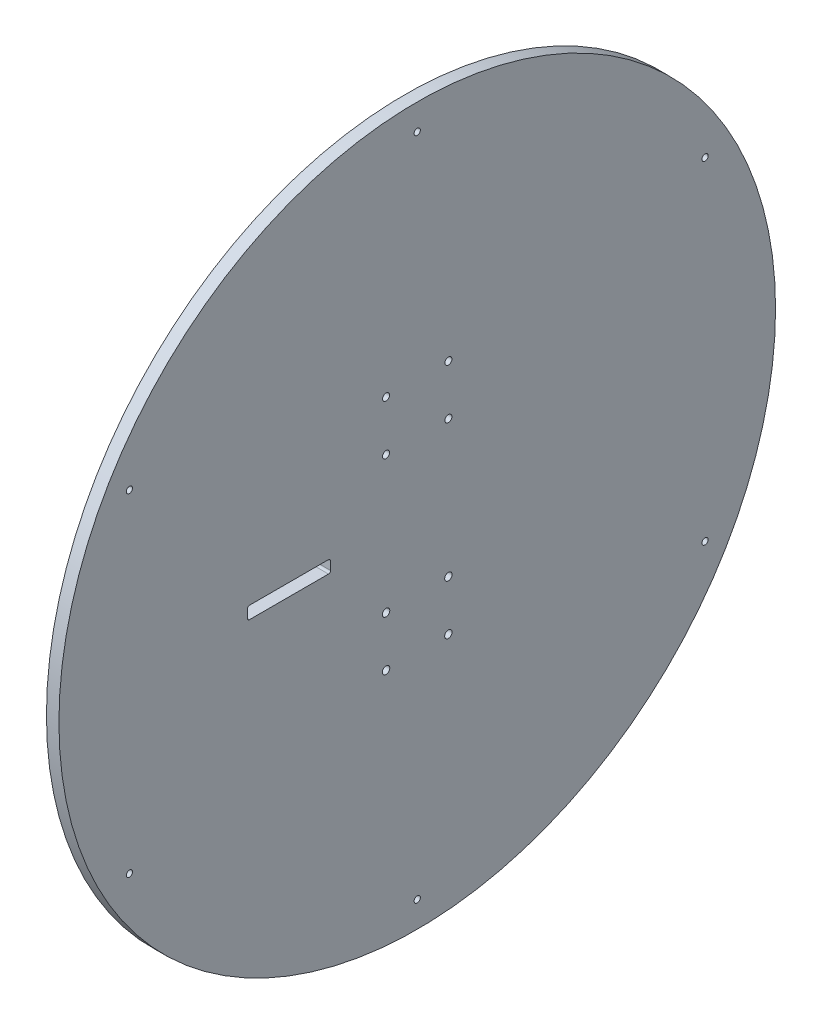
ISO-10303-21;
HEADER;
FILE_DESCRIPTION(('STEP AP214'),'2;1');
FILE_NAME('part.step','',(''),(''),'','','');
FILE_SCHEMA(('AUTOMOTIVE_DESIGN { 1 0 10303 214 1 1 1 1 }'));
ENDSEC;
DATA;
#1=APPLICATION_CONTEXT('core data for automotive mechanical design processes');
#2=APPLICATION_PROTOCOL_DEFINITION('international standard','automotive_design',2000,#1);
#3=PRODUCT_CONTEXT('',#1,'mechanical');
#4=PRODUCT('Part','Part','',(#3));
#5=PRODUCT_RELATED_PRODUCT_CATEGORY('part','',(#4));
#6=PRODUCT_DEFINITION_FORMATION('','',#4);
#7=PRODUCT_DEFINITION_CONTEXT('part definition',#1,'design');
#8=PRODUCT_DEFINITION('design','',#6,#7);
#9=PRODUCT_DEFINITION_SHAPE('','',#8);
#10=(LENGTH_UNIT() NAMED_UNIT(*) SI_UNIT(.MILLI.,.METRE.));
#11=(NAMED_UNIT(*) PLANE_ANGLE_UNIT() SI_UNIT($,.RADIAN.));
#12=(NAMED_UNIT(*) SI_UNIT($,.STERADIAN.) SOLID_ANGLE_UNIT());
#13=UNCERTAINTY_MEASURE_WITH_UNIT(LENGTH_MEASURE(1.E-05),#10,'distance_accuracy_value','');
#14=(GEOMETRIC_REPRESENTATION_CONTEXT(3) GLOBAL_UNCERTAINTY_ASSIGNED_CONTEXT((#13)) GLOBAL_UNIT_ASSIGNED_CONTEXT((#10,
#11,#12)) REPRESENTATION_CONTEXT('',''));
#15=CARTESIAN_POINT('',(0.,0.,0.));
#16=DIRECTION('',(0.,0.,1.));
#17=DIRECTION('',(1.,0.,0.));
#18=AXIS2_PLACEMENT_3D('',#15,#16,#17);
#19=CARTESIAN_POINT('',(-6.,2.00000000000001,42.7305916988347));
#20=DIRECTION('',(1.,0.,0.));
#21=DIRECTION('',(0.,0.,-1.));
#22=AXIS2_PLACEMENT_3D('',#19,#20,#21);
#23=CYLINDRICAL_SURFACE('',#22,1.);
#24=CARTESIAN_POINT('',(0.,2.00000000000001,42.7305916988347));
#25=DIRECTION('',(1.,0.,0.));
#26=DIRECTION('',(0.,0.,-1.));
#27=AXIS2_PLACEMENT_3D('',#24,#25,#26);
#28=CIRCLE('',#27,1.);
#29=CARTESIAN_POINT('',(0.,3.00000000000001,42.7305916988347));
#30=VERTEX_POINT('',#29);
#31=CARTESIAN_POINT('',(0.,2.,41.7305916988347));
#32=VERTEX_POINT('',#31);
#33=EDGE_CURVE('E180',#30,#32,#28,.F.);
#34=ORIENTED_EDGE('',*,*,#33,.F.);
#35=DIRECTION('',(1.,0.,0.));
#36=VECTOR('',#35,1.);
#37=CARTESIAN_POINT('',(-6.,3.00000000000001,42.7305916988347));
#38=LINE('',#37,#36);
#39=CARTESIAN_POINT('',(-6.,3.00000000000001,42.7305916988347));
#40=VERTEX_POINT('',#39);
#41=EDGE_CURVE('E11',#40,#30,#38,.T.);
#42=ORIENTED_EDGE('',*,*,#41,.F.);
#43=CARTESIAN_POINT('',(-6.,2.00000000000001,42.7305916988347));
#44=DIRECTION('',(1.,0.,0.));
#45=DIRECTION('',(0.,0.,-1.));
#46=AXIS2_PLACEMENT_3D('',#43,#44,#45);
#47=CIRCLE('',#46,1.);
#48=CARTESIAN_POINT('',(-6.,2.,41.7305916988347));
#49=VERTEX_POINT('',#48);
#50=EDGE_CURVE('E244',#40,#49,#47,.F.);
#51=ORIENTED_EDGE('',*,*,#50,.T.);
#52=DIRECTION('',(1.,0.,0.));
#53=VECTOR('',#52,1.);
#54=CARTESIAN_POINT('',(-6.,2.,41.7305916988347));
#55=LINE('',#54,#53);
#56=EDGE_CURVE('E42',#49,#32,#55,.T.);
#57=ORIENTED_EDGE('',*,*,#56,.T.);
#58=EDGE_LOOP('',(#34,#42,#51,#57));
#59=FACE_BOUND('',#58,.T.);
#60=ADVANCED_FACE('F39',(#59),#23,.F.);
#61=CARTESIAN_POINT('',(-6.,3.00000000000002,0.));
#62=DIRECTION('',(0.,1.,0.));
#63=DIRECTION('',(0.,0.,1.));
#64=AXIS2_PLACEMENT_3D('',#61,#62,#63);
#65=PLANE('',#64);
#66=DIRECTION('',(0.,0.,1.));
#67=VECTOR('',#66,1.);
#68=CARTESIAN_POINT('',(0.,3.00000000000002,0.));
#69=LINE('',#68,#67);
#70=CARTESIAN_POINT('',(0.,2.99999999999999,80.7305916988347));
#71=VERTEX_POINT('',#70);
#72=EDGE_CURVE('E198',#30,#71,#69,.T.);
#73=ORIENTED_EDGE('',*,*,#72,.T.);
#74=DIRECTION('',(1.,0.,0.));
#75=VECTOR('',#74,1.);
#76=CARTESIAN_POINT('',(-6.,2.99999999999999,80.7305916988347));
#77=LINE('',#76,#75);
#78=CARTESIAN_POINT('',(-6.,2.99999999999999,80.7305916988347));
#79=VERTEX_POINT('',#78);
#80=EDGE_CURVE('E48',#79,#71,#77,.T.);
#81=ORIENTED_EDGE('',*,*,#80,.F.);
#82=DIRECTION('',(0.,0.,1.));
#83=VECTOR('',#82,1.);
#84=CARTESIAN_POINT('',(-6.,3.00000000000002,0.));
#85=LINE('',#84,#83);
#86=EDGE_CURVE('E130',#40,#79,#85,.T.);
#87=ORIENTED_EDGE('',*,*,#86,.F.);
#88=ORIENTED_EDGE('',*,*,#41,.T.);
#89=EDGE_LOOP('',(#73,#81,#87,#88));
#90=FACE_BOUND('',#89,.T.);
#91=ADVANCED_FACE('F257',(#90),#65,.F.);
#92=CARTESIAN_POINT('',(-6.,1.99999999999999,80.7305916988347));
#93=DIRECTION('',(1.,0.,0.));
#94=DIRECTION('',(0.,0.,-1.));
#95=AXIS2_PLACEMENT_3D('',#92,#93,#94);
#96=CYLINDRICAL_SURFACE('',#95,1.);
#97=CARTESIAN_POINT('',(0.,1.99999999999999,80.7305916988347));
#98=DIRECTION('',(1.,0.,0.));
#99=DIRECTION('',(0.,0.,-1.));
#100=AXIS2_PLACEMENT_3D('',#97,#98,#99);
#101=CIRCLE('',#100,1.);
#102=CARTESIAN_POINT('',(0.,1.99999999999999,81.7305916988347));
#103=VERTEX_POINT('',#102);
#104=EDGE_CURVE('E114',#103,#71,#101,.F.);
#105=ORIENTED_EDGE('',*,*,#104,.F.);
#106=DIRECTION('',(1.,0.,0.));
#107=VECTOR('',#106,1.);
#108=CARTESIAN_POINT('',(-6.,1.99999999999999,81.7305916988347));
#109=LINE('',#108,#107);
#110=CARTESIAN_POINT('',(-6.,1.99999999999999,81.7305916988347));
#111=VERTEX_POINT('',#110);
#112=EDGE_CURVE('E108',#111,#103,#109,.T.);
#113=ORIENTED_EDGE('',*,*,#112,.F.);
#114=CARTESIAN_POINT('',(-6.,1.99999999999999,80.7305916988347));
#115=DIRECTION('',(1.,0.,0.));
#116=DIRECTION('',(0.,0.,-1.));
#117=AXIS2_PLACEMENT_3D('',#114,#115,#116);
#118=CIRCLE('',#117,1.);
#119=EDGE_CURVE('E112',#111,#79,#118,.F.);
#120=ORIENTED_EDGE('',*,*,#119,.T.);
#121=ORIENTED_EDGE('',*,*,#80,.T.);
#122=EDGE_LOOP('',(#105,#113,#120,#121));
#123=FACE_BOUND('',#122,.T.);
#124=ADVANCED_FACE('F110',(#123),#96,.F.);
#125=CARTESIAN_POINT('',(-6.,0.,81.7305916988347));
#126=DIRECTION('',(0.,0.,1.));
#127=DIRECTION('',(1.,0.,0.));
#128=AXIS2_PLACEMENT_3D('',#125,#126,#127);
#129=PLANE('',#128);
#130=DIRECTION('',(0.,-1.,0.));
#131=VECTOR('',#130,1.);
#132=CARTESIAN_POINT('',(0.,0.,81.7305916988347));
#133=LINE('',#132,#131);
#134=CARTESIAN_POINT('',(0.,-2.,81.7305916988347));
#135=VERTEX_POINT('',#134);
#136=EDGE_CURVE('E195',#103,#135,#133,.T.);
#137=ORIENTED_EDGE('',*,*,#136,.T.);
#138=DIRECTION('',(1.,0.,0.));
#139=VECTOR('',#138,1.);
#140=CARTESIAN_POINT('',(-6.,-2.,81.7305916988347));
#141=LINE('',#140,#139);
#142=CARTESIAN_POINT('',(-6.,-2.,81.7305916988347));
#143=VERTEX_POINT('',#142);
#144=EDGE_CURVE('E117',#143,#135,#141,.T.);
#145=ORIENTED_EDGE('',*,*,#144,.F.);
#146=DIRECTION('',(0.,-1.,0.));
#147=VECTOR('',#146,1.);
#148=CARTESIAN_POINT('',(-6.,0.,81.7305916988347));
#149=LINE('',#148,#147);
#150=EDGE_CURVE('E120',#111,#143,#149,.T.);
#151=ORIENTED_EDGE('',*,*,#150,.F.);
#152=ORIENTED_EDGE('',*,*,#112,.T.);
#153=EDGE_LOOP('',(#137,#145,#151,#152));
#154=FACE_BOUND('',#153,.T.);
#155=ADVANCED_FACE('F121',(#154),#129,.F.);
#156=CARTESIAN_POINT('',(-6.,-2.00000000000001,80.7305916988347));
#157=DIRECTION('',(1.,0.,0.));
#158=DIRECTION('',(0.,0.,-1.));
#159=AXIS2_PLACEMENT_3D('',#156,#157,#158);
#160=CYLINDRICAL_SURFACE('',#159,1.);
#161=CARTESIAN_POINT('',(0.,-2.00000000000001,80.7305916988347));
#162=DIRECTION('',(1.,0.,0.));
#163=DIRECTION('',(0.,0.,-1.));
#164=AXIS2_PLACEMENT_3D('',#161,#162,#163);
#165=CIRCLE('',#164,1.);
#166=CARTESIAN_POINT('',(0.,-3.00000000000001,80.7305916988347));
#167=VERTEX_POINT('',#166);
#168=EDGE_CURVE('E192',#135,#167,#165,.T.);
#169=ORIENTED_EDGE('',*,*,#168,.T.);
#170=DIRECTION('',(1.,0.,0.));
#171=VECTOR('',#170,1.);
#172=CARTESIAN_POINT('',(-6.,-3.00000000000001,80.7305916988347));
#173=LINE('',#172,#171);
#174=CARTESIAN_POINT('',(-6.,-3.00000000000001,80.7305916988347));
#175=VERTEX_POINT('',#174);
#176=EDGE_CURVE('E248',#175,#167,#173,.T.);
#177=ORIENTED_EDGE('',*,*,#176,.F.);
#178=CARTESIAN_POINT('',(-6.,-2.00000000000001,80.7305916988347));
#179=DIRECTION('',(1.,0.,0.));
#180=DIRECTION('',(0.,0.,-1.));
#181=AXIS2_PLACEMENT_3D('',#178,#179,#180);
#182=CIRCLE('',#181,1.);
#183=EDGE_CURVE('E125',#143,#175,#182,.T.);
#184=ORIENTED_EDGE('',*,*,#183,.F.);
#185=ORIENTED_EDGE('',*,*,#144,.T.);
#186=EDGE_LOOP('',(#169,#177,#184,#185));
#187=FACE_BOUND('',#186,.T.);
#188=ADVANCED_FACE('F271',(#187),#160,.F.);
#189=CARTESIAN_POINT('',(-6.,-2.99999999999998,0.));
#190=DIRECTION('',(0.,1.,0.));
#191=DIRECTION('',(0.,0.,1.));
#192=AXIS2_PLACEMENT_3D('',#189,#190,#191);
#193=PLANE('',#192);
#194=DIRECTION('',(0.,0.,1.));
#195=VECTOR('',#194,1.);
#196=CARTESIAN_POINT('',(0.,-2.99999999999998,0.));
#197=LINE('',#196,#195);
#198=CARTESIAN_POINT('',(0.,-2.99999999999999,42.7305916988347));
#199=VERTEX_POINT('',#198);
#200=EDGE_CURVE('E189',#199,#167,#197,.T.);
#201=ORIENTED_EDGE('',*,*,#200,.F.);
#202=DIRECTION('',(1.,0.,0.));
#203=VECTOR('',#202,1.);
#204=CARTESIAN_POINT('',(-6.,-2.99999999999999,42.7305916988347));
#205=LINE('',#204,#203);
#206=CARTESIAN_POINT('',(-6.,-2.99999999999999,42.7305916988347));
#207=VERTEX_POINT('',#206);
#208=EDGE_CURVE('E250',#207,#199,#205,.T.);
#209=ORIENTED_EDGE('',*,*,#208,.F.);
#210=DIRECTION('',(0.,0.,1.));
#211=VECTOR('',#210,1.);
#212=CARTESIAN_POINT('',(-6.,-2.99999999999998,0.));
#213=LINE('',#212,#211);
#214=EDGE_CURVE('E266',#207,#175,#213,.T.);
#215=ORIENTED_EDGE('',*,*,#214,.T.);
#216=ORIENTED_EDGE('',*,*,#176,.T.);
#217=EDGE_LOOP('',(#201,#209,#215,#216));
#218=FACE_BOUND('',#217,.T.);
#219=ADVANCED_FACE('F275',(#218),#193,.T.);
#220=CARTESIAN_POINT('',(-6.,-1.99999999999999,42.7305916988347));
#221=DIRECTION('',(1.,0.,0.));
#222=DIRECTION('',(0.,0.,-1.));
#223=AXIS2_PLACEMENT_3D('',#220,#221,#222);
#224=CYLINDRICAL_SURFACE('',#223,1.);
#225=CARTESIAN_POINT('',(0.,-1.99999999999999,42.7305916988347));
#226=DIRECTION('',(1.,0.,0.));
#227=DIRECTION('',(0.,0.,-1.));
#228=AXIS2_PLACEMENT_3D('',#225,#226,#227);
#229=CIRCLE('',#228,1.);
#230=CARTESIAN_POINT('',(0.,-1.99999999999999,41.7305916988347));
#231=VERTEX_POINT('',#230);
#232=EDGE_CURVE('E186',#231,#199,#229,.F.);
#233=ORIENTED_EDGE('',*,*,#232,.F.);
#234=DIRECTION('',(1.,0.,0.));
#235=VECTOR('',#234,1.);
#236=CARTESIAN_POINT('',(-6.,-1.99999999999999,41.7305916988347));
#237=LINE('',#236,#235);
#238=CARTESIAN_POINT('',(-6.,-1.99999999999999,41.7305916988347));
#239=VERTEX_POINT('',#238);
#240=EDGE_CURVE('E251',#239,#231,#237,.T.);
#241=ORIENTED_EDGE('',*,*,#240,.F.);
#242=CARTESIAN_POINT('',(-6.,-1.99999999999999,42.7305916988347));
#243=DIRECTION('',(1.,0.,0.));
#244=DIRECTION('',(0.,0.,-1.));
#245=AXIS2_PLACEMENT_3D('',#242,#243,#244);
#246=CIRCLE('',#245,1.);
#247=EDGE_CURVE('E261',#239,#207,#246,.F.);
#248=ORIENTED_EDGE('',*,*,#247,.T.);
#249=ORIENTED_EDGE('',*,*,#208,.T.);
#250=EDGE_LOOP('',(#233,#241,#248,#249));
#251=FACE_BOUND('',#250,.T.);
#252=ADVANCED_FACE('F277',(#251),#224,.F.);
#253=CARTESIAN_POINT('',(-6.,32.9363293094924,-15.));
#254=DIRECTION('',(1.,0.,0.));
#255=DIRECTION('',(0.,0.,-1.));
#256=AXIS2_PLACEMENT_3D('',#253,#254,#255);
#257=CYLINDRICAL_SURFACE('',#256,1.68973253813912);
#258=CARTESIAN_POINT('',(-6.,32.9363293094924,-15.));
#259=DIRECTION('',(1.,0.,0.));
#260=DIRECTION('',(0.,0.,-1.));
#261=AXIS2_PLACEMENT_3D('',#258,#259,#260);
#262=CIRCLE('',#261,1.68973253813912);
#263=CARTESIAN_POINT('',(-6.,32.9363293094924,-16.6897325381391));
#264=VERTEX_POINT('',#263);
#265=EDGE_CURVE('E174',#264,#264,#262,.T.);
#266=ORIENTED_EDGE('',*,*,#265,.F.);
#267=EDGE_LOOP('',(#266));
#268=FACE_BOUND('',#267,.T.);
#269=CARTESIAN_POINT('',(0.,32.9363293094924,-15.));
#270=DIRECTION('',(1.,0.,0.));
#271=DIRECTION('',(0.,0.,-1.));
#272=AXIS2_PLACEMENT_3D('',#269,#270,#271);
#273=CIRCLE('',#272,1.68973253813912);
#274=CARTESIAN_POINT('',(0.,32.9363293094924,-16.6897325381391));
#275=VERTEX_POINT('',#274);
#276=EDGE_CURVE('E239',#275,#275,#273,.T.);
#277=ORIENTED_EDGE('',*,*,#276,.T.);
#278=EDGE_LOOP('',(#277));
#279=FACE_BOUND('',#278,.T.);
#280=ADVANCED_FACE('F279',(#268,#279),#257,.F.);
#281=CARTESIAN_POINT('',(-6.,56.9363293094924,15.));
#282=DIRECTION('',(1.,0.,0.));
#283=DIRECTION('',(0.,0.,-1.));
#284=AXIS2_PLACEMENT_3D('',#281,#282,#283);
#285=CYLINDRICAL_SURFACE('',#284,1.68973253813912);
#286=CARTESIAN_POINT('',(-6.,56.9363293094924,15.));
#287=DIRECTION('',(1.,0.,0.));
#288=DIRECTION('',(0.,0.,-1.));
#289=AXIS2_PLACEMENT_3D('',#286,#287,#288);
#290=CIRCLE('',#289,1.68973253813912);
#291=CARTESIAN_POINT('',(-6.,56.9363293094924,13.3102674618609));
#292=VERTEX_POINT('',#291);
#293=EDGE_CURVE('E171',#292,#292,#290,.T.);
#294=ORIENTED_EDGE('',*,*,#293,.F.);
#295=EDGE_LOOP('',(#294));
#296=FACE_BOUND('',#295,.T.);
#297=CARTESIAN_POINT('',(0.,56.9363293094924,15.));
#298=DIRECTION('',(1.,0.,0.));
#299=DIRECTION('',(0.,0.,-1.));
#300=AXIS2_PLACEMENT_3D('',#297,#298,#299);
#301=CIRCLE('',#300,1.68973253813912);
#302=CARTESIAN_POINT('',(0.,56.9363293094924,13.3102674618609));
#303=VERTEX_POINT('',#302);
#304=EDGE_CURVE('E236',#303,#303,#301,.T.);
#305=ORIENTED_EDGE('',*,*,#304,.T.);
#306=EDGE_LOOP('',(#305));
#307=FACE_BOUND('',#306,.T.);
#308=ADVANCED_FACE('F285',(#296,#307),#285,.F.);
#309=CARTESIAN_POINT('',(-6.,32.9363293094924,15.));
#310=DIRECTION('',(1.,0.,0.));
#311=DIRECTION('',(0.,0.,-1.));
#312=AXIS2_PLACEMENT_3D('',#309,#310,#311);
#313=CYLINDRICAL_SURFACE('',#312,1.68973253813912);
#314=CARTESIAN_POINT('',(-6.,32.9363293094924,15.));
#315=DIRECTION('',(1.,0.,0.));
#316=DIRECTION('',(0.,0.,-1.));
#317=AXIS2_PLACEMENT_3D('',#314,#315,#316);
#318=CIRCLE('',#317,1.68973253813912);
#319=CARTESIAN_POINT('',(-6.,32.9363293094924,13.3102674618609));
#320=VERTEX_POINT('',#319);
#321=EDGE_CURVE('E168',#320,#320,#318,.T.);
#322=ORIENTED_EDGE('',*,*,#321,.F.);
#323=EDGE_LOOP('',(#322));
#324=FACE_BOUND('',#323,.T.);
#325=CARTESIAN_POINT('',(0.,32.9363293094924,15.));
#326=DIRECTION('',(1.,0.,0.));
#327=DIRECTION('',(0.,0.,-1.));
#328=AXIS2_PLACEMENT_3D('',#325,#326,#327);
#329=CIRCLE('',#328,1.68973253813912);
#330=CARTESIAN_POINT('',(0.,32.9363293094924,13.3102674618609));
#331=VERTEX_POINT('',#330);
#332=EDGE_CURVE('E233',#331,#331,#329,.T.);
#333=ORIENTED_EDGE('',*,*,#332,.T.);
#334=EDGE_LOOP('',(#333));
#335=FACE_BOUND('',#334,.T.);
#336=ADVANCED_FACE('F332',(#324,#335),#313,.F.);
#337=CARTESIAN_POINT('',(-6.,159.999999999986,1.05869761299687E-13));
#338=DIRECTION('',(1.,0.,0.));
#339=DIRECTION('',(0.,0.,-1.));
#340=AXIS2_PLACEMENT_3D('',#337,#338,#339);
#341=CYLINDRICAL_SURFACE('',#340,1.5);
#342=CARTESIAN_POINT('',(-6.,159.999999999986,1.05869761299687E-13));
#343=DIRECTION('',(1.,0.,0.));
#344=DIRECTION('',(0.,0.,-1.));
#345=AXIS2_PLACEMENT_3D('',#342,#343,#344);
#346=CIRCLE('',#345,1.5);
#347=CARTESIAN_POINT('',(-6.,159.999999999986,-1.49999999999989));
#348=VERTEX_POINT('',#347);
#349=EDGE_CURVE('E165',#348,#348,#346,.T.);
#350=ORIENTED_EDGE('',*,*,#349,.F.);
#351=EDGE_LOOP('',(#350));
#352=FACE_BOUND('',#351,.T.);
#353=CARTESIAN_POINT('',(0.,159.999999999986,1.05869761299687E-13));
#354=DIRECTION('',(1.,0.,0.));
#355=DIRECTION('',(0.,0.,-1.));
#356=AXIS2_PLACEMENT_3D('',#353,#354,#355);
#357=CIRCLE('',#356,1.5);
#358=CARTESIAN_POINT('',(0.,159.999999999986,-1.49999999999989));
#359=VERTEX_POINT('',#358);
#360=EDGE_CURVE('E230',#359,#359,#357,.T.);
#361=ORIENTED_EDGE('',*,*,#360,.T.);
#362=EDGE_LOOP('',(#361));
#363=FACE_BOUND('',#362,.T.);
#364=ADVANCED_FACE('F342',(#352,#363),#341,.F.);
#365=CARTESIAN_POINT('',(-6.,80.000000000007,-138.564064605506));
#366=DIRECTION('',(1.,0.,0.));
#367=DIRECTION('',(0.,0.,-1.));
#368=AXIS2_PLACEMENT_3D('',#365,#366,#367);
#369=CYLINDRICAL_SURFACE('',#368,1.5);
#370=CARTESIAN_POINT('',(-6.,80.000000000007,-138.564064605506));
#371=DIRECTION('',(1.,0.,0.));
#372=DIRECTION('',(0.,0.,-1.));
#373=AXIS2_PLACEMENT_3D('',#370,#371,#372);
#374=CIRCLE('',#373,1.5);
#375=CARTESIAN_POINT('',(-6.,80.000000000007,-140.064064605506));
#376=VERTEX_POINT('',#375);
#377=EDGE_CURVE('E162',#376,#376,#374,.T.);
#378=ORIENTED_EDGE('',*,*,#377,.F.);
#379=EDGE_LOOP('',(#378));
#380=FACE_BOUND('',#379,.T.);
#381=CARTESIAN_POINT('',(0.,80.000000000007,-138.564064605506));
#382=DIRECTION('',(1.,0.,0.));
#383=DIRECTION('',(0.,0.,-1.));
#384=AXIS2_PLACEMENT_3D('',#381,#382,#383);
#385=CIRCLE('',#384,1.5);
#386=CARTESIAN_POINT('',(0.,80.000000000007,-140.064064605506));
#387=VERTEX_POINT('',#386);
#388=EDGE_CURVE('E227',#387,#387,#385,.T.);
#389=ORIENTED_EDGE('',*,*,#388,.T.);
#390=EDGE_LOOP('',(#389));
#391=FACE_BOUND('',#390,.T.);
#392=ADVANCED_FACE('F352',(#380,#391),#369,.F.);
#393=CARTESIAN_POINT('',(-6.,79.9999999999793,138.564064605491));
#394=DIRECTION('',(1.,0.,0.));
#395=DIRECTION('',(0.,0.,-1.));
#396=AXIS2_PLACEMENT_3D('',#393,#394,#395);
#397=CYLINDRICAL_SURFACE('',#396,1.5);
#398=CARTESIAN_POINT('',(-6.,79.9999999999793,138.564064605491));
#399=DIRECTION('',(1.,0.,0.));
#400=DIRECTION('',(0.,0.,-1.));
#401=AXIS2_PLACEMENT_3D('',#398,#399,#400);
#402=CIRCLE('',#401,1.5);
#403=CARTESIAN_POINT('',(-6.,79.9999999999793,137.064064605491));
#404=VERTEX_POINT('',#403);
#405=EDGE_CURVE('E159',#404,#404,#402,.T.);
#406=ORIENTED_EDGE('',*,*,#405,.F.);
#407=EDGE_LOOP('',(#406));
#408=FACE_BOUND('',#407,.T.);
#409=CARTESIAN_POINT('',(0.,79.9999999999793,138.564064605491));
#410=DIRECTION('',(1.,0.,0.));
#411=DIRECTION('',(0.,0.,-1.));
#412=AXIS2_PLACEMENT_3D('',#409,#410,#411);
#413=CIRCLE('',#412,1.5);
#414=CARTESIAN_POINT('',(0.,79.9999999999793,137.064064605491));
#415=VERTEX_POINT('',#414);
#416=EDGE_CURVE('E224',#415,#415,#413,.T.);
#417=ORIENTED_EDGE('',*,*,#416,.T.);
#418=EDGE_LOOP('',(#417));
#419=FACE_BOUND('',#418,.T.);
#420=ADVANCED_FACE('F362',(#408,#419),#397,.F.);
#421=CARTESIAN_POINT('',(-6.,0.,0.));
#422=DIRECTION('',(1.,0.,0.));
#423=DIRECTION('',(0.,0.,-1.));
#424=AXIS2_PLACEMENT_3D('',#421,#422,#423);
#425=CYLINDRICAL_SURFACE('',#424,172.5);
#426=CARTESIAN_POINT('',(-6.,0.,0.));
#427=DIRECTION('',(1.,0.,0.));
#428=DIRECTION('',(0.,0.,-1.));
#429=AXIS2_PLACEMENT_3D('',#426,#427,#428);
#430=CIRCLE('',#429,172.5);
#431=CARTESIAN_POINT('',(-6.,0.,-172.5));
#432=VERTEX_POINT('',#431);
#433=EDGE_CURVE('E156',#432,#432,#430,.T.);
#434=ORIENTED_EDGE('',*,*,#433,.T.);
#435=EDGE_LOOP('',(#434));
#436=FACE_BOUND('',#435,.T.);
#437=CARTESIAN_POINT('',(0.,0.,0.));
#438=DIRECTION('',(1.,0.,0.));
#439=DIRECTION('',(0.,0.,-1.));
#440=AXIS2_PLACEMENT_3D('',#437,#438,#439);
#441=CIRCLE('',#440,172.5);
#442=CARTESIAN_POINT('',(0.,0.,-172.5));
#443=VERTEX_POINT('',#442);
#444=EDGE_CURVE('E221',#443,#443,#441,.T.);
#445=ORIENTED_EDGE('',*,*,#444,.F.);
#446=EDGE_LOOP('',(#445));
#447=FACE_BOUND('',#446,.T.);
#448=ADVANCED_FACE('F372',(#436,#447),#425,.T.);
#449=CARTESIAN_POINT('',(-6.,-80.000000000007,138.564064605475));
#450=DIRECTION('',(1.,0.,0.));
#451=DIRECTION('',(0.,0.,-1.));
#452=AXIS2_PLACEMENT_3D('',#449,#450,#451);
#453=CYLINDRICAL_SURFACE('',#452,1.5);
#454=CARTESIAN_POINT('',(-6.,-80.000000000007,138.564064605475));
#455=DIRECTION('',(1.,0.,0.));
#456=DIRECTION('',(0.,0.,-1.));
#457=AXIS2_PLACEMENT_3D('',#454,#455,#456);
#458=CIRCLE('',#457,1.5);
#459=CARTESIAN_POINT('',(-6.,-80.000000000007,137.064064605475));
#460=VERTEX_POINT('',#459);
#461=EDGE_CURVE('E153',#460,#460,#458,.T.);
#462=ORIENTED_EDGE('',*,*,#461,.F.);
#463=EDGE_LOOP('',(#462));
#464=FACE_BOUND('',#463,.T.);
#465=CARTESIAN_POINT('',(0.,-80.000000000007,138.564064605475));
#466=DIRECTION('',(1.,0.,0.));
#467=DIRECTION('',(0.,0.,-1.));
#468=AXIS2_PLACEMENT_3D('',#465,#466,#467);
#469=CIRCLE('',#468,1.5);
#470=CARTESIAN_POINT('',(0.,-80.000000000007,137.064064605475));
#471=VERTEX_POINT('',#470);
#472=EDGE_CURVE('E218',#471,#471,#469,.T.);
#473=ORIENTED_EDGE('',*,*,#472,.T.);
#474=EDGE_LOOP('',(#473));
#475=FACE_BOUND('',#474,.T.);
#476=ADVANCED_FACE('F382',(#464,#475),#453,.F.);
#477=CARTESIAN_POINT('',(-6.,-159.999999999986,-3.17288766769907E-11));
#478=DIRECTION('',(1.,0.,0.));
#479=DIRECTION('',(0.,0.,-1.));
#480=AXIS2_PLACEMENT_3D('',#477,#478,#479);
#481=CYLINDRICAL_SURFACE('',#480,1.5);
#482=CARTESIAN_POINT('',(-6.,-159.999999999986,-3.17288766769907E-11));
#483=DIRECTION('',(1.,0.,0.));
#484=DIRECTION('',(0.,0.,-1.));
#485=AXIS2_PLACEMENT_3D('',#482,#483,#484);
#486=CIRCLE('',#485,1.5);
#487=CARTESIAN_POINT('',(-6.,-159.999999999986,-1.50000000003173));
#488=VERTEX_POINT('',#487);
#489=EDGE_CURVE('E150',#488,#488,#486,.T.);
#490=ORIENTED_EDGE('',*,*,#489,.F.);
#491=EDGE_LOOP('',(#490));
#492=FACE_BOUND('',#491,.T.);
#493=CARTESIAN_POINT('',(0.,-159.999999999986,-3.17288766769907E-11));
#494=DIRECTION('',(1.,0.,0.));
#495=DIRECTION('',(0.,0.,-1.));
#496=AXIS2_PLACEMENT_3D('',#493,#494,#495);
#497=CIRCLE('',#496,1.5);
#498=CARTESIAN_POINT('',(0.,-159.999999999986,-1.50000000003173));
#499=VERTEX_POINT('',#498);
#500=EDGE_CURVE('E215',#499,#499,#497,.T.);
#501=ORIENTED_EDGE('',*,*,#500,.T.);
#502=EDGE_LOOP('',(#501));
#503=FACE_BOUND('',#502,.T.);
#504=ADVANCED_FACE('F392',(#492,#503),#481,.F.);
#505=CARTESIAN_POINT('',(-6.,-79.9999999999793,-138.564064605522));
#506=DIRECTION('',(1.,0.,0.));
#507=DIRECTION('',(0.,0.,-1.));
#508=AXIS2_PLACEMENT_3D('',#505,#506,#507);
#509=CYLINDRICAL_SURFACE('',#508,1.5);
#510=CARTESIAN_POINT('',(-6.,-79.9999999999793,-138.564064605522));
#511=DIRECTION('',(1.,0.,0.));
#512=DIRECTION('',(0.,0.,-1.));
#513=AXIS2_PLACEMENT_3D('',#510,#511,#512);
#514=CIRCLE('',#513,1.5);
#515=CARTESIAN_POINT('',(-6.,-79.9999999999793,-140.064064605522));
#516=VERTEX_POINT('',#515);
#517=EDGE_CURVE('E147',#516,#516,#514,.T.);
#518=ORIENTED_EDGE('',*,*,#517,.F.);
#519=EDGE_LOOP('',(#518));
#520=FACE_BOUND('',#519,.T.);
#521=CARTESIAN_POINT('',(0.,-79.9999999999793,-138.564064605522));
#522=DIRECTION('',(1.,0.,0.));
#523=DIRECTION('',(0.,0.,-1.));
#524=AXIS2_PLACEMENT_3D('',#521,#522,#523);
#525=CIRCLE('',#524,1.5);
#526=CARTESIAN_POINT('',(0.,-79.9999999999793,-140.064064605522));
#527=VERTEX_POINT('',#526);
#528=EDGE_CURVE('E212',#527,#527,#525,.T.);
#529=ORIENTED_EDGE('',*,*,#528,.T.);
#530=EDGE_LOOP('',(#529));
#531=FACE_BOUND('',#530,.T.);
#532=ADVANCED_FACE('F402',(#520,#531),#509,.F.);
#533=CARTESIAN_POINT('',(-6.,-56.9363293094924,15.));
#534=DIRECTION('',(1.,0.,0.));
#535=DIRECTION('',(0.,0.,-1.));
#536=AXIS2_PLACEMENT_3D('',#533,#534,#535);
#537=CYLINDRICAL_SURFACE('',#536,1.78575658839966);
#538=CARTESIAN_POINT('',(-6.,-56.9363293094924,15.));
#539=DIRECTION('',(1.,0.,0.));
#540=DIRECTION('',(0.,0.,-1.));
#541=AXIS2_PLACEMENT_3D('',#538,#539,#540);
#542=CIRCLE('',#541,1.78575658839966);
#543=CARTESIAN_POINT('',(-6.,-56.9363293094924,13.2142434116003));
#544=VERTEX_POINT('',#543);
#545=EDGE_CURVE('E144',#544,#544,#542,.T.);
#546=ORIENTED_EDGE('',*,*,#545,.F.);
#547=EDGE_LOOP('',(#546));
#548=FACE_BOUND('',#547,.T.);
#549=CARTESIAN_POINT('',(0.,-56.9363293094924,15.));
#550=DIRECTION('',(1.,0.,0.));
#551=DIRECTION('',(0.,0.,-1.));
#552=AXIS2_PLACEMENT_3D('',#549,#550,#551);
#553=CIRCLE('',#552,1.78575658839966);
#554=CARTESIAN_POINT('',(0.,-56.9363293094924,13.2142434116003));
#555=VERTEX_POINT('',#554);
#556=EDGE_CURVE('E209',#555,#555,#553,.T.);
#557=ORIENTED_EDGE('',*,*,#556,.T.);
#558=EDGE_LOOP('',(#557));
#559=FACE_BOUND('',#558,.T.);
#560=ADVANCED_FACE('F412',(#548,#559),#537,.F.);
#561=CARTESIAN_POINT('',(-6.,-56.9363293094924,-15.));
#562=DIRECTION('',(1.,0.,0.));
#563=DIRECTION('',(0.,0.,-1.));
#564=AXIS2_PLACEMENT_3D('',#561,#562,#563);
#565=CYLINDRICAL_SURFACE('',#564,1.78575658839965);
#566=CARTESIAN_POINT('',(-6.,-56.9363293094924,-15.));
#567=DIRECTION('',(1.,0.,0.));
#568=DIRECTION('',(0.,0.,-1.));
#569=AXIS2_PLACEMENT_3D('',#566,#567,#568);
#570=CIRCLE('',#569,1.78575658839965);
#571=CARTESIAN_POINT('',(-6.,-56.9363293094924,-16.7857565883997));
#572=VERTEX_POINT('',#571);
#573=EDGE_CURVE('E141',#572,#572,#570,.T.);
#574=ORIENTED_EDGE('',*,*,#573,.F.);
#575=EDGE_LOOP('',(#574));
#576=FACE_BOUND('',#575,.T.);
#577=CARTESIAN_POINT('',(0.,-56.9363293094924,-15.));
#578=DIRECTION('',(1.,0.,0.));
#579=DIRECTION('',(0.,0.,-1.));
#580=AXIS2_PLACEMENT_3D('',#577,#578,#579);
#581=CIRCLE('',#580,1.78575658839965);
#582=CARTESIAN_POINT('',(0.,-56.9363293094924,-16.7857565883997));
#583=VERTEX_POINT('',#582);
#584=EDGE_CURVE('E206',#583,#583,#581,.T.);
#585=ORIENTED_EDGE('',*,*,#584,.T.);
#586=EDGE_LOOP('',(#585));
#587=FACE_BOUND('',#586,.T.);
#588=ADVANCED_FACE('F422',(#576,#587),#565,.F.);
#589=CARTESIAN_POINT('',(-6.,-32.9363293094924,-15.));
#590=DIRECTION('',(1.,0.,0.));
#591=DIRECTION('',(0.,0.,-1.));
#592=AXIS2_PLACEMENT_3D('',#589,#590,#591);
#593=CYLINDRICAL_SURFACE('',#592,1.78575658839965);
#594=CARTESIAN_POINT('',(-6.,-32.9363293094924,-15.));
#595=DIRECTION('',(1.,0.,0.));
#596=DIRECTION('',(0.,0.,-1.));
#597=AXIS2_PLACEMENT_3D('',#594,#595,#596);
#598=CIRCLE('',#597,1.78575658839965);
#599=CARTESIAN_POINT('',(-6.,-32.9363293094924,-16.7857565883997));
#600=VERTEX_POINT('',#599);
#601=EDGE_CURVE('E138',#600,#600,#598,.T.);
#602=ORIENTED_EDGE('',*,*,#601,.F.);
#603=EDGE_LOOP('',(#602));
#604=FACE_BOUND('',#603,.T.);
#605=CARTESIAN_POINT('',(0.,-32.9363293094924,-15.));
#606=DIRECTION('',(1.,0.,0.));
#607=DIRECTION('',(0.,0.,-1.));
#608=AXIS2_PLACEMENT_3D('',#605,#606,#607);
#609=CIRCLE('',#608,1.78575658839965);
#610=CARTESIAN_POINT('',(0.,-32.9363293094924,-16.7857565883997));
#611=VERTEX_POINT('',#610);
#612=EDGE_CURVE('E203',#611,#611,#609,.T.);
#613=ORIENTED_EDGE('',*,*,#612,.T.);
#614=EDGE_LOOP('',(#613));
#615=FACE_BOUND('',#614,.T.);
#616=ADVANCED_FACE('F432',(#604,#615),#593,.F.);
#617=CARTESIAN_POINT('',(-6.,-32.9363293094924,15.));
#618=DIRECTION('',(1.,0.,0.));
#619=DIRECTION('',(0.,0.,-1.));
#620=AXIS2_PLACEMENT_3D('',#617,#618,#619);
#621=CYLINDRICAL_SURFACE('',#620,1.78575658839965);
#622=CARTESIAN_POINT('',(-6.,-32.9363293094924,15.));
#623=DIRECTION('',(1.,0.,0.));
#624=DIRECTION('',(0.,0.,-1.));
#625=AXIS2_PLACEMENT_3D('',#622,#623,#624);
#626=CIRCLE('',#625,1.78575658839965);
#627=CARTESIAN_POINT('',(-6.,-32.9363293094924,13.2142434116003));
#628=VERTEX_POINT('',#627);
#629=EDGE_CURVE('E132',#628,#628,#626,.T.);
#630=ORIENTED_EDGE('',*,*,#629,.F.);
#631=EDGE_LOOP('',(#630));
#632=FACE_BOUND('',#631,.T.);
#633=CARTESIAN_POINT('',(0.,-32.9363293094924,15.));
#634=DIRECTION('',(1.,0.,0.));
#635=DIRECTION('',(0.,0.,-1.));
#636=AXIS2_PLACEMENT_3D('',#633,#634,#635);
#637=CIRCLE('',#636,1.78575658839965);
#638=CARTESIAN_POINT('',(0.,-32.9363293094924,13.2142434116003));
#639=VERTEX_POINT('',#638);
#640=EDGE_CURVE('E200',#639,#639,#637,.T.);
#641=ORIENTED_EDGE('',*,*,#640,.T.);
#642=EDGE_LOOP('',(#641));
#643=FACE_BOUND('',#642,.T.);
#644=ADVANCED_FACE('F299',(#632,#643),#621,.F.);
#645=CARTESIAN_POINT('',(-6.,0.,41.7305916988347));
#646=DIRECTION('',(0.,0.,1.));
#647=DIRECTION('',(1.,0.,0.));
#648=AXIS2_PLACEMENT_3D('',#645,#646,#647);
#649=PLANE('',#648);
#650=DIRECTION('',(0.,-1.,0.));
#651=VECTOR('',#650,1.);
#652=CARTESIAN_POINT('',(0.,0.,41.7305916988347));
#653=LINE('',#652,#651);
#654=EDGE_CURVE('E183',#32,#231,#653,.T.);
#655=ORIENTED_EDGE('',*,*,#654,.F.);
#656=ORIENTED_EDGE('',*,*,#56,.F.);
#657=DIRECTION('',(0.,-1.,0.));
#658=VECTOR('',#657,1.);
#659=CARTESIAN_POINT('',(-6.,0.,41.7305916988347));
#660=LINE('',#659,#658);
#661=EDGE_CURVE('E259',#49,#239,#660,.T.);
#662=ORIENTED_EDGE('',*,*,#661,.T.);
#663=ORIENTED_EDGE('',*,*,#240,.T.);
#664=EDGE_LOOP('',(#655,#656,#662,#663));
#665=FACE_BOUND('',#664,.T.);
#666=ADVANCED_FACE('F253',(#665),#649,.T.);
#667=CARTESIAN_POINT('',(-6.,56.9363293094924,-15.));
#668=DIRECTION('',(1.,0.,0.));
#669=DIRECTION('',(0.,0.,-1.));
#670=AXIS2_PLACEMENT_3D('',#667,#668,#669);
#671=CYLINDRICAL_SURFACE('',#670,1.68973253813912);
#672=CARTESIAN_POINT('',(-6.,56.9363293094924,-15.));
#673=DIRECTION('',(1.,0.,0.));
#674=DIRECTION('',(0.,0.,-1.));
#675=AXIS2_PLACEMENT_3D('',#672,#673,#674);
#676=CIRCLE('',#675,1.68973253813912);
#677=CARTESIAN_POINT('',(-6.,56.9363293094924,-16.6897325381391));
#678=VERTEX_POINT('',#677);
#679=EDGE_CURVE('E177',#678,#678,#676,.T.);
#680=ORIENTED_EDGE('',*,*,#679,.F.);
#681=EDGE_LOOP('',(#680));
#682=FACE_BOUND('',#681,.T.);
#683=CARTESIAN_POINT('',(0.,56.9363293094924,-15.));
#684=DIRECTION('',(1.,0.,0.));
#685=DIRECTION('',(0.,0.,-1.));
#686=AXIS2_PLACEMENT_3D('',#683,#684,#685);
#687=CIRCLE('',#686,1.68973253813912);
#688=CARTESIAN_POINT('',(0.,56.9363293094924,-16.6897325381391));
#689=VERTEX_POINT('',#688);
#690=EDGE_CURVE('E242',#689,#689,#687,.T.);
#691=ORIENTED_EDGE('',*,*,#690,.T.);
#692=EDGE_LOOP('',(#691));
#693=FACE_BOUND('',#692,.T.);
#694=ADVANCED_FACE('F458',(#682,#693),#671,.F.);
#695=CARTESIAN_POINT('',(-6.,0.,0.));
#696=DIRECTION('',(1.,0.,0.));
#697=DIRECTION('',(0.,0.,-1.));
#698=AXIS2_PLACEMENT_3D('',#695,#696,#697);
#699=PLANE('',#698);
#700=ORIENTED_EDGE('',*,*,#50,.F.);
#701=ORIENTED_EDGE('',*,*,#86,.T.);
#702=ORIENTED_EDGE('',*,*,#119,.F.);
#703=ORIENTED_EDGE('',*,*,#150,.T.);
#704=ORIENTED_EDGE('',*,*,#183,.T.);
#705=ORIENTED_EDGE('',*,*,#214,.F.);
#706=ORIENTED_EDGE('',*,*,#247,.F.);
#707=ORIENTED_EDGE('',*,*,#661,.F.);
#708=EDGE_LOOP('',(#700,#701,#702,#703,#704,#705,#706,#707));
#709=FACE_BOUND('',#708,.T.);
#710=ORIENTED_EDGE('',*,*,#629,.T.);
#711=EDGE_LOOP('',(#710));
#712=FACE_BOUND('',#711,.T.);
#713=ORIENTED_EDGE('',*,*,#601,.T.);
#714=EDGE_LOOP('',(#713));
#715=FACE_BOUND('',#714,.T.);
#716=ORIENTED_EDGE('',*,*,#573,.T.);
#717=EDGE_LOOP('',(#716));
#718=FACE_BOUND('',#717,.T.);
#719=ORIENTED_EDGE('',*,*,#545,.T.);
#720=EDGE_LOOP('',(#719));
#721=FACE_BOUND('',#720,.T.);
#722=ORIENTED_EDGE('',*,*,#517,.T.);
#723=EDGE_LOOP('',(#722));
#724=FACE_BOUND('',#723,.T.);
#725=ORIENTED_EDGE('',*,*,#489,.T.);
#726=EDGE_LOOP('',(#725));
#727=FACE_BOUND('',#726,.T.);
#728=ORIENTED_EDGE('',*,*,#461,.T.);
#729=EDGE_LOOP('',(#728));
#730=FACE_BOUND('',#729,.T.);
#731=ORIENTED_EDGE('',*,*,#433,.F.);
#732=EDGE_LOOP('',(#731));
#733=FACE_BOUND('',#732,.T.);
#734=ORIENTED_EDGE('',*,*,#405,.T.);
#735=EDGE_LOOP('',(#734));
#736=FACE_BOUND('',#735,.T.);
#737=ORIENTED_EDGE('',*,*,#377,.T.);
#738=EDGE_LOOP('',(#737));
#739=FACE_BOUND('',#738,.T.);
#740=ORIENTED_EDGE('',*,*,#349,.T.);
#741=EDGE_LOOP('',(#740));
#742=FACE_BOUND('',#741,.T.);
#743=ORIENTED_EDGE('',*,*,#321,.T.);
#744=EDGE_LOOP('',(#743));
#745=FACE_BOUND('',#744,.T.);
#746=ORIENTED_EDGE('',*,*,#293,.T.);
#747=EDGE_LOOP('',(#746));
#748=FACE_BOUND('',#747,.T.);
#749=ORIENTED_EDGE('',*,*,#265,.T.);
#750=EDGE_LOOP('',(#749));
#751=FACE_BOUND('',#750,.T.);
#752=ORIENTED_EDGE('',*,*,#679,.T.);
#753=EDGE_LOOP('',(#752));
#754=FACE_BOUND('',#753,.T.);
#755=ADVANCED_FACE('F128',(#709,#712,#715,#718,#721,#724,#727,#730,#733,#736,#739,#742,#745,
#748,#751,#754),#699,.F.);
#756=CARTESIAN_POINT('',(0.,0.,0.));
#757=DIRECTION('',(1.,0.,0.));
#758=DIRECTION('',(0.,0.,-1.));
#759=AXIS2_PLACEMENT_3D('',#756,#757,#758);
#760=PLANE('',#759);
#761=ORIENTED_EDGE('',*,*,#33,.T.);
#762=ORIENTED_EDGE('',*,*,#654,.T.);
#763=ORIENTED_EDGE('',*,*,#232,.T.);
#764=ORIENTED_EDGE('',*,*,#200,.T.);
#765=ORIENTED_EDGE('',*,*,#168,.F.);
#766=ORIENTED_EDGE('',*,*,#136,.F.);
#767=ORIENTED_EDGE('',*,*,#104,.T.);
#768=ORIENTED_EDGE('',*,*,#72,.F.);
#769=EDGE_LOOP('',(#761,#762,#763,#764,#765,#766,#767,#768));
#770=FACE_BOUND('',#769,.T.);
#771=ORIENTED_EDGE('',*,*,#640,.F.);
#772=EDGE_LOOP('',(#771));
#773=FACE_BOUND('',#772,.T.);
#774=ORIENTED_EDGE('',*,*,#612,.F.);
#775=EDGE_LOOP('',(#774));
#776=FACE_BOUND('',#775,.T.);
#777=ORIENTED_EDGE('',*,*,#584,.F.);
#778=EDGE_LOOP('',(#777));
#779=FACE_BOUND('',#778,.T.);
#780=ORIENTED_EDGE('',*,*,#556,.F.);
#781=EDGE_LOOP('',(#780));
#782=FACE_BOUND('',#781,.T.);
#783=ORIENTED_EDGE('',*,*,#528,.F.);
#784=EDGE_LOOP('',(#783));
#785=FACE_BOUND('',#784,.T.);
#786=ORIENTED_EDGE('',*,*,#500,.F.);
#787=EDGE_LOOP('',(#786));
#788=FACE_BOUND('',#787,.T.);
#789=ORIENTED_EDGE('',*,*,#472,.F.);
#790=EDGE_LOOP('',(#789));
#791=FACE_BOUND('',#790,.T.);
#792=ORIENTED_EDGE('',*,*,#444,.T.);
#793=EDGE_LOOP('',(#792));
#794=FACE_BOUND('',#793,.T.);
#795=ORIENTED_EDGE('',*,*,#416,.F.);
#796=EDGE_LOOP('',(#795));
#797=FACE_BOUND('',#796,.T.);
#798=ORIENTED_EDGE('',*,*,#388,.F.);
#799=EDGE_LOOP('',(#798));
#800=FACE_BOUND('',#799,.T.);
#801=ORIENTED_EDGE('',*,*,#360,.F.);
#802=EDGE_LOOP('',(#801));
#803=FACE_BOUND('',#802,.T.);
#804=ORIENTED_EDGE('',*,*,#332,.F.);
#805=EDGE_LOOP('',(#804));
#806=FACE_BOUND('',#805,.T.);
#807=ORIENTED_EDGE('',*,*,#304,.F.);
#808=EDGE_LOOP('',(#807));
#809=FACE_BOUND('',#808,.T.);
#810=ORIENTED_EDGE('',*,*,#276,.F.);
#811=EDGE_LOOP('',(#810));
#812=FACE_BOUND('',#811,.T.);
#813=ORIENTED_EDGE('',*,*,#690,.F.);
#814=EDGE_LOOP('',(#813));
#815=FACE_BOUND('',#814,.T.);
#816=ADVANCED_FACE('F255',(#770,#773,#776,#779,#782,#785,#788,#791,#794,#797,#800,#803,#806,
#809,#812,#815),#760,.T.);
#817=CLOSED_SHELL('',(#60,#91,#124,#155,#188,#219,#252,#280,#308,#336,#364,#392,#420,#448,#476,
#504,#532,#560,#588,#616,#644,#666,#694,#755,#816));
#818=MANIFOLD_SOLID_BREP('B2',#817);
#819=ADVANCED_BREP_SHAPE_REPRESENTATION('',(#18,#818),#14);
#820=SHAPE_DEFINITION_REPRESENTATION(#9,#819);
ENDSEC;
END-ISO-10303-21;
